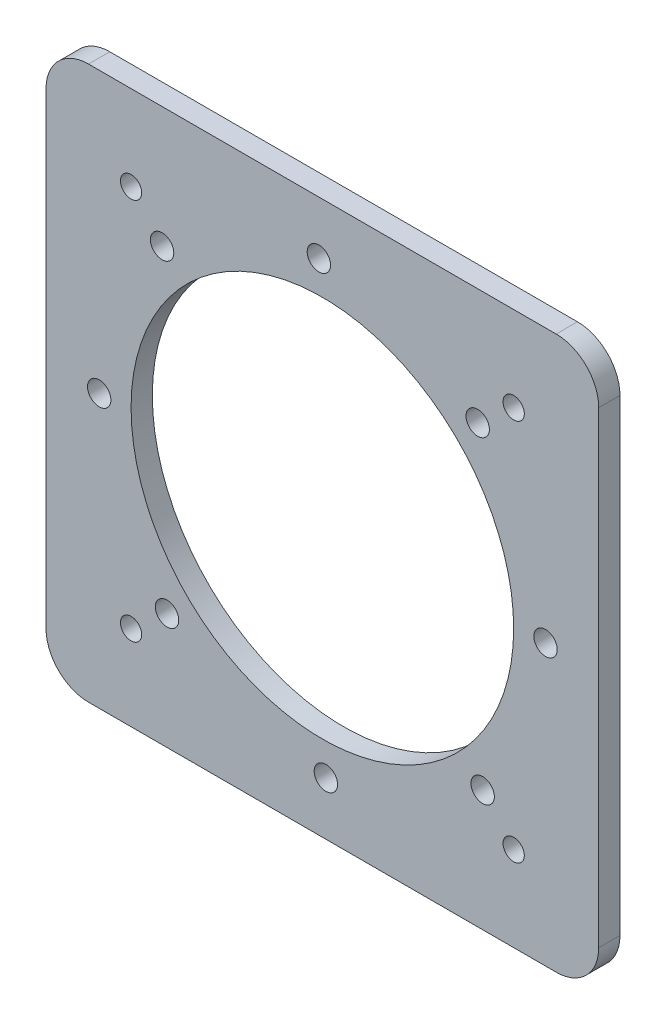
ISO-10303-21;
HEADER;
FILE_DESCRIPTION(('STEP AP214'),'2;1');
FILE_NAME('part.step','',(''),(''),'','','');
FILE_SCHEMA(('AUTOMOTIVE_DESIGN { 1 0 10303 214 1 1 1 1 }'));
ENDSEC;
DATA;
#1=APPLICATION_CONTEXT('core data for automotive mechanical design processes');
#2=APPLICATION_PROTOCOL_DEFINITION('international standard','automotive_design',2000,#1);
#3=PRODUCT_CONTEXT('',#1,'mechanical');
#4=PRODUCT('Part','Part','',(#3));
#5=PRODUCT_RELATED_PRODUCT_CATEGORY('part','',(#4));
#6=PRODUCT_DEFINITION_FORMATION('','',#4);
#7=PRODUCT_DEFINITION_CONTEXT('part definition',#1,'design');
#8=PRODUCT_DEFINITION('design','',#6,#7);
#9=PRODUCT_DEFINITION_SHAPE('','',#8);
#10=(LENGTH_UNIT() NAMED_UNIT(*) SI_UNIT(.MILLI.,.METRE.));
#11=(NAMED_UNIT(*) PLANE_ANGLE_UNIT() SI_UNIT($,.RADIAN.));
#12=(NAMED_UNIT(*) SI_UNIT($,.STERADIAN.) SOLID_ANGLE_UNIT());
#13=UNCERTAINTY_MEASURE_WITH_UNIT(LENGTH_MEASURE(1.E-05),#10,'distance_accuracy_value','');
#14=(GEOMETRIC_REPRESENTATION_CONTEXT(3) GLOBAL_UNCERTAINTY_ASSIGNED_CONTEXT((#13)) GLOBAL_UNIT_ASSIGNED_CONTEXT((#10,
#11,#12)) REPRESENTATION_CONTEXT('',''));
#15=CARTESIAN_POINT('',(0.,0.,0.));
#16=DIRECTION('',(0.,0.,1.));
#17=DIRECTION('',(1.,0.,0.));
#18=AXIS2_PLACEMENT_3D('',#15,#16,#17);
#19=CARTESIAN_POINT('',(65.,65.,5.));
#20=DIRECTION('',(-1.,0.,0.));
#21=DIRECTION('',(0.,-1.,0.));
#22=AXIS2_PLACEMENT_3D('',#19,#20,#21);
#23=PLANE('',#22);
#24=DIRECTION('',(0.,1.,0.));
#25=VECTOR('',#24,1.);
#26=CARTESIAN_POINT('',(65.,65.,0.));
#27=LINE('',#26,#25);
#28=CARTESIAN_POINT('',(65.,-55.,0.));
#29=VERTEX_POINT('',#28);
#30=CARTESIAN_POINT('',(65.,55.,0.));
#31=VERTEX_POINT('',#30);
#32=EDGE_CURVE('E138',#29,#31,#27,.T.);
#33=ORIENTED_EDGE('',*,*,#32,.T.);
#34=DIRECTION('',(0.,0.,-1.));
#35=VECTOR('',#34,1.);
#36=CARTESIAN_POINT('',(65.,55.,5.));
#37=LINE('',#36,#35);
#38=CARTESIAN_POINT('',(65.,55.,5.));
#39=VERTEX_POINT('',#38);
#40=EDGE_CURVE('E116',#31,#39,#37,.F.);
#41=ORIENTED_EDGE('',*,*,#40,.T.);
#42=DIRECTION('',(0.,1.,0.));
#43=VECTOR('',#42,1.);
#44=CARTESIAN_POINT('',(65.,65.,5.));
#45=LINE('',#44,#43);
#46=CARTESIAN_POINT('',(65.,-55.,5.));
#47=VERTEX_POINT('',#46);
#48=EDGE_CURVE('E148',#47,#39,#45,.T.);
#49=ORIENTED_EDGE('',*,*,#48,.F.);
#50=DIRECTION('',(0.,0.,-1.));
#51=VECTOR('',#50,1.);
#52=CARTESIAN_POINT('',(65.,-55.,5.));
#53=LINE('',#52,#51);
#54=EDGE_CURVE('E121',#47,#29,#53,.T.);
#55=ORIENTED_EDGE('',*,*,#54,.T.);
#56=EDGE_LOOP('',(#33,#41,#49,#55));
#57=FACE_BOUND('',#56,.T.);
#58=ADVANCED_FACE('F45',(#57),#23,.F.);
#59=CARTESIAN_POINT('',(-65.,65.,5.));
#60=DIRECTION('',(0.,-1.,0.));
#61=DIRECTION('',(0.,0.,-1.));
#62=AXIS2_PLACEMENT_3D('',#59,#60,#61);
#63=PLANE('',#62);
#64=DIRECTION('',(-1.,0.,0.));
#65=VECTOR('',#64,1.);
#66=CARTESIAN_POINT('',(-65.,65.,5.));
#67=LINE('',#66,#65);
#68=CARTESIAN_POINT('',(55.,65.,5.));
#69=VERTEX_POINT('',#68);
#70=CARTESIAN_POINT('',(-55.,65.,5.));
#71=VERTEX_POINT('',#70);
#72=EDGE_CURVE('E131',#69,#71,#67,.T.);
#73=ORIENTED_EDGE('',*,*,#72,.F.);
#74=DIRECTION('',(0.,0.,-1.));
#75=VECTOR('',#74,1.);
#76=CARTESIAN_POINT('',(55.,65.,5.));
#77=LINE('',#76,#75);
#78=CARTESIAN_POINT('',(55.,65.,0.));
#79=VERTEX_POINT('',#78);
#80=EDGE_CURVE('E115',#69,#79,#77,.T.);
#81=ORIENTED_EDGE('',*,*,#80,.T.);
#82=DIRECTION('',(-1.,0.,0.));
#83=VECTOR('',#82,1.);
#84=CARTESIAN_POINT('',(-65.,65.,0.));
#85=LINE('',#84,#83);
#86=CARTESIAN_POINT('',(-55.,65.,0.));
#87=VERTEX_POINT('',#86);
#88=EDGE_CURVE('E128',#79,#87,#85,.T.);
#89=ORIENTED_EDGE('',*,*,#88,.T.);
#90=DIRECTION('',(0.,0.,-1.));
#91=VECTOR('',#90,1.);
#92=CARTESIAN_POINT('',(-55.,65.,5.));
#93=LINE('',#92,#91);
#94=EDGE_CURVE('E133',#87,#71,#93,.F.);
#95=ORIENTED_EDGE('',*,*,#94,.T.);
#96=EDGE_LOOP('',(#73,#81,#89,#95));
#97=FACE_BOUND('',#96,.T.);
#98=ADVANCED_FACE('F127',(#97),#63,.F.);
#99=CARTESIAN_POINT('',(-65.,65.,5.));
#100=DIRECTION('',(1.,0.,0.));
#101=DIRECTION('',(0.,0.,-1.));
#102=AXIS2_PLACEMENT_3D('',#99,#100,#101);
#103=PLANE('',#102);
#104=DIRECTION('',(0.,-1.,0.));
#105=VECTOR('',#104,1.);
#106=CARTESIAN_POINT('',(-65.,65.,0.));
#107=LINE('',#106,#105);
#108=CARTESIAN_POINT('',(-65.,55.,0.));
#109=VERTEX_POINT('',#108);
#110=CARTESIAN_POINT('',(-65.,-55.,0.));
#111=VERTEX_POINT('',#110);
#112=EDGE_CURVE('E137',#109,#111,#107,.T.);
#113=ORIENTED_EDGE('',*,*,#112,.T.);
#114=DIRECTION('',(0.,0.,-1.));
#115=VECTOR('',#114,1.);
#116=CARTESIAN_POINT('',(-65.,-55.,5.));
#117=LINE('',#116,#115);
#118=CARTESIAN_POINT('',(-65.,-55.,5.));
#119=VERTEX_POINT('',#118);
#120=EDGE_CURVE('E11',#111,#119,#117,.F.);
#121=ORIENTED_EDGE('',*,*,#120,.T.);
#122=DIRECTION('',(0.,-1.,0.));
#123=VECTOR('',#122,1.);
#124=CARTESIAN_POINT('',(-65.,65.,5.));
#125=LINE('',#124,#123);
#126=CARTESIAN_POINT('',(-65.,55.,5.));
#127=VERTEX_POINT('',#126);
#128=EDGE_CURVE('E174',#127,#119,#125,.T.);
#129=ORIENTED_EDGE('',*,*,#128,.F.);
#130=DIRECTION('',(0.,0.,-1.));
#131=VECTOR('',#130,1.);
#132=CARTESIAN_POINT('',(-65.,55.,5.));
#133=LINE('',#132,#131);
#134=EDGE_CURVE('E53',#127,#109,#133,.T.);
#135=ORIENTED_EDGE('',*,*,#134,.T.);
#136=EDGE_LOOP('',(#113,#121,#129,#135));
#137=FACE_BOUND('',#136,.T.);
#138=ADVANCED_FACE('F172',(#137),#103,.F.);
#139=CARTESIAN_POINT('',(-65.,-65.,5.));
#140=DIRECTION('',(0.,1.,0.));
#141=DIRECTION('',(0.,0.,1.));
#142=AXIS2_PLACEMENT_3D('',#139,#140,#141);
#143=PLANE('',#142);
#144=DIRECTION('',(1.,0.,0.));
#145=VECTOR('',#144,1.);
#146=CARTESIAN_POINT('',(-65.,-65.,0.));
#147=LINE('',#146,#145);
#148=CARTESIAN_POINT('',(-55.,-65.,0.));
#149=VERTEX_POINT('',#148);
#150=CARTESIAN_POINT('',(55.,-65.,0.));
#151=VERTEX_POINT('',#150);
#152=EDGE_CURVE('E141',#149,#151,#147,.T.);
#153=ORIENTED_EDGE('',*,*,#152,.T.);
#154=DIRECTION('',(0.,0.,-1.));
#155=VECTOR('',#154,1.);
#156=CARTESIAN_POINT('',(55.,-65.,5.));
#157=LINE('',#156,#155);
#158=CARTESIAN_POINT('',(55.,-65.,5.));
#159=VERTEX_POINT('',#158);
#160=EDGE_CURVE('E60',#151,#159,#157,.F.);
#161=ORIENTED_EDGE('',*,*,#160,.T.);
#162=DIRECTION('',(1.,0.,0.));
#163=VECTOR('',#162,1.);
#164=CARTESIAN_POINT('',(-65.,-65.,5.));
#165=LINE('',#164,#163);
#166=CARTESIAN_POINT('',(-55.,-65.,5.));
#167=VERTEX_POINT('',#166);
#168=EDGE_CURVE('E149',#167,#159,#165,.T.);
#169=ORIENTED_EDGE('',*,*,#168,.F.);
#170=DIRECTION('',(0.,0.,-1.));
#171=VECTOR('',#170,1.);
#172=CARTESIAN_POINT('',(-55.,-65.,5.));
#173=LINE('',#172,#171);
#174=EDGE_CURVE('E165',#167,#149,#173,.T.);
#175=ORIENTED_EDGE('',*,*,#174,.T.);
#176=EDGE_LOOP('',(#153,#161,#169,#175));
#177=FACE_BOUND('',#176,.T.);
#178=ADVANCED_FACE('F181',(#177),#143,.F.);
#179=CARTESIAN_POINT('',(0.,0.,5.));
#180=DIRECTION('',(0.,0.,1.));
#181=DIRECTION('',(1.,0.,0.));
#182=AXIS2_PLACEMENT_3D('',#179,#180,#181);
#183=PLANE('',#182);
#184=CARTESIAN_POINT('',(-45.0000000002168,45.,5.));
#185=DIRECTION('',(0.,0.,1.));
#186=DIRECTION('',(1.,0.,0.));
#187=AXIS2_PLACEMENT_3D('',#184,#185,#186);
#188=CIRCLE('',#187,2.5);
#189=CARTESIAN_POINT('',(-42.5000000002168,45.,5.));
#190=VERTEX_POINT('',#189);
#191=EDGE_CURVE('E245',#190,#190,#188,.T.);
#192=ORIENTED_EDGE('',*,*,#191,.F.);
#193=EDGE_LOOP('',(#192));
#194=FACE_BOUND('',#193,.T.);
#195=CARTESIAN_POINT('',(44.9999999997842,-45.,5.));
#196=DIRECTION('',(0.,0.,1.));
#197=DIRECTION('',(1.,0.,0.));
#198=AXIS2_PLACEMENT_3D('',#195,#196,#197);
#199=CIRCLE('',#198,2.5);
#200=CARTESIAN_POINT('',(47.4999999997842,-45.,5.));
#201=VERTEX_POINT('',#200);
#202=EDGE_CURVE('E251',#201,#201,#199,.T.);
#203=ORIENTED_EDGE('',*,*,#202,.F.);
#204=EDGE_LOOP('',(#203));
#205=FACE_BOUND('',#204,.T.);
#206=CARTESIAN_POINT('',(-45.0000000002158,-45.,5.));
#207=DIRECTION('',(0.,0.,1.));
#208=DIRECTION('',(1.,0.,0.));
#209=AXIS2_PLACEMENT_3D('',#206,#207,#208);
#210=CIRCLE('',#209,2.5);
#211=CARTESIAN_POINT('',(-42.5000000002158,-45.,5.));
#212=VERTEX_POINT('',#211);
#213=EDGE_CURVE('E252',#212,#212,#210,.T.);
#214=ORIENTED_EDGE('',*,*,#213,.F.);
#215=EDGE_LOOP('',(#214));
#216=FACE_BOUND('',#215,.T.);
#217=CARTESIAN_POINT('',(44.9999999997832,45.,5.));
#218=DIRECTION('',(0.,0.,1.));
#219=DIRECTION('',(1.,0.,0.));
#220=AXIS2_PLACEMENT_3D('',#217,#218,#219);
#221=CIRCLE('',#220,2.5);
#222=CARTESIAN_POINT('',(47.4999999997832,45.,5.));
#223=VERTEX_POINT('',#222);
#224=EDGE_CURVE('E242',#223,#223,#221,.T.);
#225=ORIENTED_EDGE('',*,*,#224,.F.);
#226=EDGE_LOOP('',(#225));
#227=FACE_BOUND('',#226,.T.);
#228=CARTESIAN_POINT('',(-52.493537780627,-0.823705817561204,5.));
#229=DIRECTION('',(0.,0.,1.));
#230=DIRECTION('',(1.,0.,0.));
#231=AXIS2_PLACEMENT_3D('',#228,#229,#230);
#232=CIRCLE('',#231,2.75);
#233=CARTESIAN_POINT('',(-49.743537780627,-0.823705817561204,5.));
#234=VERTEX_POINT('',#233);
#235=EDGE_CURVE('E191',#234,#234,#232,.T.);
#236=ORIENTED_EDGE('',*,*,#235,.F.);
#237=EDGE_LOOP('',(#236));
#238=FACE_BOUND('',#237,.T.);
#239=CARTESIAN_POINT('',(-36.5360885638533,-37.7009845024539,5.));
#240=DIRECTION('',(0.,0.,1.));
#241=DIRECTION('',(1.,0.,0.));
#242=AXIS2_PLACEMENT_3D('',#239,#240,#241);
#243=CIRCLE('',#242,2.75);
#244=CARTESIAN_POINT('',(-33.7860885638533,-37.7009845024539,5.));
#245=VERTEX_POINT('',#244);
#246=EDGE_CURVE('E196',#245,#245,#243,.T.);
#247=ORIENTED_EDGE('',*,*,#246,.F.);
#248=EDGE_LOOP('',(#247));
#249=FACE_BOUND('',#248,.T.);
#250=CARTESIAN_POINT('',(0.823705817561204,-52.493537780627,5.));
#251=DIRECTION('',(0.,0.,1.));
#252=DIRECTION('',(1.,0.,0.));
#253=AXIS2_PLACEMENT_3D('',#250,#251,#252);
#254=CIRCLE('',#253,2.75);
#255=CARTESIAN_POINT('',(3.5737058175612,-52.493537780627,5.));
#256=VERTEX_POINT('',#255);
#257=EDGE_CURVE('E199',#256,#256,#254,.T.);
#258=ORIENTED_EDGE('',*,*,#257,.F.);
#259=EDGE_LOOP('',(#258));
#260=FACE_BOUND('',#259,.T.);
#261=CARTESIAN_POINT('',(37.7009845024539,-36.5360885638533,5.));
#262=DIRECTION('',(0.,0.,1.));
#263=DIRECTION('',(1.,0.,0.));
#264=AXIS2_PLACEMENT_3D('',#261,#262,#263);
#265=CIRCLE('',#264,2.75);
#266=CARTESIAN_POINT('',(40.4509845024539,-36.5360885638533,5.));
#267=VERTEX_POINT('',#266);
#268=EDGE_CURVE('E202',#267,#267,#265,.T.);
#269=ORIENTED_EDGE('',*,*,#268,.F.);
#270=EDGE_LOOP('',(#269));
#271=FACE_BOUND('',#270,.T.);
#272=CARTESIAN_POINT('',(52.493537780627,0.823705817561204,5.));
#273=DIRECTION('',(0.,0.,1.));
#274=DIRECTION('',(1.,0.,0.));
#275=AXIS2_PLACEMENT_3D('',#272,#273,#274);
#276=CIRCLE('',#275,2.75);
#277=CARTESIAN_POINT('',(55.243537780627,0.823705817561204,5.));
#278=VERTEX_POINT('',#277);
#279=EDGE_CURVE('E205',#278,#278,#276,.T.);
#280=ORIENTED_EDGE('',*,*,#279,.F.);
#281=EDGE_LOOP('',(#280));
#282=FACE_BOUND('',#281,.T.);
#283=CARTESIAN_POINT('',(36.5360885638533,37.7009845024539,5.));
#284=DIRECTION('',(0.,0.,1.));
#285=DIRECTION('',(1.,0.,0.));
#286=AXIS2_PLACEMENT_3D('',#283,#284,#285);
#287=CIRCLE('',#286,2.75);
#288=CARTESIAN_POINT('',(39.2860885638533,37.7009845024539,5.));
#289=VERTEX_POINT('',#288);
#290=EDGE_CURVE('E208',#289,#289,#287,.T.);
#291=ORIENTED_EDGE('',*,*,#290,.F.);
#292=EDGE_LOOP('',(#291));
#293=FACE_BOUND('',#292,.T.);
#294=CARTESIAN_POINT('',(-0.823705817561134,52.493537780627,5.));
#295=DIRECTION('',(0.,0.,1.));
#296=DIRECTION('',(1.,0.,0.));
#297=AXIS2_PLACEMENT_3D('',#294,#295,#296);
#298=CIRCLE('',#297,2.75);
#299=CARTESIAN_POINT('',(1.92629418243886,52.493537780627,5.));
#300=VERTEX_POINT('',#299);
#301=EDGE_CURVE('E211',#300,#300,#298,.T.);
#302=ORIENTED_EDGE('',*,*,#301,.F.);
#303=EDGE_LOOP('',(#302));
#304=FACE_BOUND('',#303,.T.);
#305=CARTESIAN_POINT('',(-37.7009845024539,36.5360885638533,5.));
#306=DIRECTION('',(0.,0.,1.));
#307=DIRECTION('',(1.,0.,0.));
#308=AXIS2_PLACEMENT_3D('',#305,#306,#307);
#309=CIRCLE('',#308,2.75);
#310=CARTESIAN_POINT('',(-34.9509845024539,36.5360885638533,5.));
#311=VERTEX_POINT('',#310);
#312=EDGE_CURVE('E214',#311,#311,#309,.T.);
#313=ORIENTED_EDGE('',*,*,#312,.F.);
#314=EDGE_LOOP('',(#313));
#315=FACE_BOUND('',#314,.T.);
#316=CARTESIAN_POINT('',(0.,0.,5.));
#317=DIRECTION('',(0.,0.,1.));
#318=DIRECTION('',(1.,0.,0.));
#319=AXIS2_PLACEMENT_3D('',#316,#317,#318);
#320=CIRCLE('',#319,45.);
#321=CARTESIAN_POINT('',(45.,0.,5.));
#322=VERTEX_POINT('',#321);
#323=EDGE_CURVE('E188',#322,#322,#320,.F.);
#324=ORIENTED_EDGE('',*,*,#323,.T.);
#325=EDGE_LOOP('',(#324));
#326=FACE_BOUND('',#325,.T.);
#327=ORIENTED_EDGE('',*,*,#48,.T.);
#328=CARTESIAN_POINT('',(55.,55.,5.));
#329=DIRECTION('',(0.,0.,1.));
#330=DIRECTION('',(1.,0.,0.));
#331=AXIS2_PLACEMENT_3D('',#328,#329,#330);
#332=CIRCLE('',#331,10.);
#333=EDGE_CURVE('E163',#39,#69,#332,.T.);
#334=ORIENTED_EDGE('',*,*,#333,.T.);
#335=ORIENTED_EDGE('',*,*,#72,.T.);
#336=CARTESIAN_POINT('',(-55.,55.,5.));
#337=DIRECTION('',(0.,0.,1.));
#338=DIRECTION('',(1.,0.,0.));
#339=AXIS2_PLACEMENT_3D('',#336,#337,#338);
#340=CIRCLE('',#339,10.);
#341=EDGE_CURVE('E158',#71,#127,#340,.T.);
#342=ORIENTED_EDGE('',*,*,#341,.T.);
#343=ORIENTED_EDGE('',*,*,#128,.T.);
#344=CARTESIAN_POINT('',(-55.,-55.,5.));
#345=DIRECTION('',(0.,0.,1.));
#346=DIRECTION('',(1.,0.,0.));
#347=AXIS2_PLACEMENT_3D('',#344,#345,#346);
#348=CIRCLE('',#347,10.);
#349=EDGE_CURVE('E67',#119,#167,#348,.T.);
#350=ORIENTED_EDGE('',*,*,#349,.T.);
#351=ORIENTED_EDGE('',*,*,#168,.T.);
#352=CARTESIAN_POINT('',(55.,-55.,5.));
#353=DIRECTION('',(0.,0.,1.));
#354=DIRECTION('',(1.,0.,0.));
#355=AXIS2_PLACEMENT_3D('',#352,#353,#354);
#356=CIRCLE('',#355,10.);
#357=EDGE_CURVE('E161',#159,#47,#356,.T.);
#358=ORIENTED_EDGE('',*,*,#357,.T.);
#359=EDGE_LOOP('',(#327,#334,#335,#342,#343,#350,#351,#358));
#360=FACE_BOUND('',#359,.T.);
#361=ADVANCED_FACE('F268',(#194,#205,#216,#227,#238,#249,#260,#271,#282,#293,#304,#315,#326,
#360),#183,.T.);
#362=CARTESIAN_POINT('',(0.,0.,0.));
#363=DIRECTION('',(0.,0.,1.));
#364=DIRECTION('',(1.,0.,0.));
#365=AXIS2_PLACEMENT_3D('',#362,#363,#364);
#366=PLANE('',#365);
#367=CARTESIAN_POINT('',(-45.0000000002168,45.,0.));
#368=DIRECTION('',(0.,0.,1.));
#369=DIRECTION('',(1.,0.,0.));
#370=AXIS2_PLACEMENT_3D('',#367,#368,#369);
#371=CIRCLE('',#370,2.5);
#372=CARTESIAN_POINT('',(-42.5000000002168,45.,0.));
#373=VERTEX_POINT('',#372);
#374=EDGE_CURVE('E255',#373,#373,#371,.T.);
#375=ORIENTED_EDGE('',*,*,#374,.T.);
#376=EDGE_LOOP('',(#375));
#377=FACE_BOUND('',#376,.T.);
#378=CARTESIAN_POINT('',(44.9999999997842,-45.,0.));
#379=DIRECTION('',(0.,0.,1.));
#380=DIRECTION('',(1.,0.,0.));
#381=AXIS2_PLACEMENT_3D('',#378,#379,#380);
#382=CIRCLE('',#381,2.5);
#383=CARTESIAN_POINT('',(47.4999999997842,-45.,0.));
#384=VERTEX_POINT('',#383);
#385=EDGE_CURVE('E248',#384,#384,#382,.T.);
#386=ORIENTED_EDGE('',*,*,#385,.T.);
#387=EDGE_LOOP('',(#386));
#388=FACE_BOUND('',#387,.T.);
#389=CARTESIAN_POINT('',(-45.0000000002158,-45.,0.));
#390=DIRECTION('',(0.,0.,1.));
#391=DIRECTION('',(1.,0.,0.));
#392=AXIS2_PLACEMENT_3D('',#389,#390,#391);
#393=CIRCLE('',#392,2.5);
#394=CARTESIAN_POINT('',(-42.5000000002158,-45.,0.));
#395=VERTEX_POINT('',#394);
#396=EDGE_CURVE('E260',#395,#395,#393,.T.);
#397=ORIENTED_EDGE('',*,*,#396,.T.);
#398=EDGE_LOOP('',(#397));
#399=FACE_BOUND('',#398,.T.);
#400=CARTESIAN_POINT('',(44.9999999997832,45.,0.));
#401=DIRECTION('',(0.,0.,1.));
#402=DIRECTION('',(1.,0.,0.));
#403=AXIS2_PLACEMENT_3D('',#400,#401,#402);
#404=CIRCLE('',#403,2.5);
#405=CARTESIAN_POINT('',(47.4999999997832,45.,0.));
#406=VERTEX_POINT('',#405);
#407=EDGE_CURVE('E237',#406,#406,#404,.T.);
#408=ORIENTED_EDGE('',*,*,#407,.T.);
#409=EDGE_LOOP('',(#408));
#410=FACE_BOUND('',#409,.T.);
#411=CARTESIAN_POINT('',(-52.493537780627,-0.823705817561204,0.));
#412=DIRECTION('',(0.,0.,-1.));
#413=DIRECTION('',(-1.,0.,0.));
#414=AXIS2_PLACEMENT_3D('',#411,#412,#413);
#415=CIRCLE('',#414,2.75);
#416=CARTESIAN_POINT('',(-55.243537780627,-0.823705817561204,0.));
#417=VERTEX_POINT('',#416);
#418=EDGE_CURVE('E220',#417,#417,#415,.T.);
#419=ORIENTED_EDGE('',*,*,#418,.F.);
#420=EDGE_LOOP('',(#419));
#421=FACE_BOUND('',#420,.T.);
#422=CARTESIAN_POINT('',(-36.5360885638533,-37.7009845024539,0.));
#423=DIRECTION('',(0.,0.,-1.));
#424=DIRECTION('',(-1.,0.,0.));
#425=AXIS2_PLACEMENT_3D('',#422,#423,#424);
#426=CIRCLE('',#425,2.75);
#427=CARTESIAN_POINT('',(-39.2860885638533,-37.7009845024539,0.));
#428=VERTEX_POINT('',#427);
#429=EDGE_CURVE('E228',#428,#428,#426,.T.);
#430=ORIENTED_EDGE('',*,*,#429,.F.);
#431=EDGE_LOOP('',(#430));
#432=FACE_BOUND('',#431,.T.);
#433=CARTESIAN_POINT('',(0.823705817561204,-52.493537780627,0.));
#434=DIRECTION('',(0.,0.,-1.));
#435=DIRECTION('',(-1.,0.,0.));
#436=AXIS2_PLACEMENT_3D('',#433,#434,#435);
#437=CIRCLE('',#436,2.75);
#438=CARTESIAN_POINT('',(-1.9262941824388,-52.493537780627,0.));
#439=VERTEX_POINT('',#438);
#440=EDGE_CURVE('E224',#439,#439,#437,.T.);
#441=ORIENTED_EDGE('',*,*,#440,.F.);
#442=EDGE_LOOP('',(#441));
#443=FACE_BOUND('',#442,.T.);
#444=CARTESIAN_POINT('',(37.7009845024539,-36.5360885638533,0.));
#445=DIRECTION('',(0.,0.,-1.));
#446=DIRECTION('',(-1.,0.,0.));
#447=AXIS2_PLACEMENT_3D('',#444,#445,#446);
#448=CIRCLE('',#447,2.75);
#449=CARTESIAN_POINT('',(34.9509845024539,-36.5360885638533,0.));
#450=VERTEX_POINT('',#449);
#451=EDGE_CURVE('E221',#450,#450,#448,.T.);
#452=ORIENTED_EDGE('',*,*,#451,.F.);
#453=EDGE_LOOP('',(#452));
#454=FACE_BOUND('',#453,.T.);
#455=CARTESIAN_POINT('',(52.493537780627,0.823705817561204,0.));
#456=DIRECTION('',(0.,0.,-1.));
#457=DIRECTION('',(-1.,0.,0.));
#458=AXIS2_PLACEMENT_3D('',#455,#456,#457);
#459=CIRCLE('',#458,2.75);
#460=CARTESIAN_POINT('',(49.743537780627,0.823705817561204,0.));
#461=VERTEX_POINT('',#460);
#462=EDGE_CURVE('E225',#461,#461,#459,.T.);
#463=ORIENTED_EDGE('',*,*,#462,.F.);
#464=EDGE_LOOP('',(#463));
#465=FACE_BOUND('',#464,.T.);
#466=CARTESIAN_POINT('',(36.5360885638533,37.7009845024539,0.));
#467=DIRECTION('',(0.,0.,-1.));
#468=DIRECTION('',(-1.,0.,0.));
#469=AXIS2_PLACEMENT_3D('',#466,#467,#468);
#470=CIRCLE('',#469,2.75);
#471=CARTESIAN_POINT('',(33.7860885638533,37.7009845024539,0.));
#472=VERTEX_POINT('',#471);
#473=EDGE_CURVE('E236',#472,#472,#470,.T.);
#474=ORIENTED_EDGE('',*,*,#473,.F.);
#475=EDGE_LOOP('',(#474));
#476=FACE_BOUND('',#475,.T.);
#477=CARTESIAN_POINT('',(-0.823705817561134,52.493537780627,0.));
#478=DIRECTION('',(0.,0.,-1.));
#479=DIRECTION('',(-1.,0.,0.));
#480=AXIS2_PLACEMENT_3D('',#477,#478,#479);
#481=CIRCLE('',#480,2.75);
#482=CARTESIAN_POINT('',(-3.57370581756113,52.493537780627,0.));
#483=VERTEX_POINT('',#482);
#484=EDGE_CURVE('E233',#483,#483,#481,.T.);
#485=ORIENTED_EDGE('',*,*,#484,.F.);
#486=EDGE_LOOP('',(#485));
#487=FACE_BOUND('',#486,.T.);
#488=CARTESIAN_POINT('',(-37.7009845024539,36.5360885638533,0.));
#489=DIRECTION('',(0.,0.,-1.));
#490=DIRECTION('',(-1.,0.,0.));
#491=AXIS2_PLACEMENT_3D('',#488,#489,#490);
#492=CIRCLE('',#491,2.75);
#493=CARTESIAN_POINT('',(-40.4509845024539,36.5360885638533,0.));
#494=VERTEX_POINT('',#493);
#495=EDGE_CURVE('E217',#494,#494,#492,.T.);
#496=ORIENTED_EDGE('',*,*,#495,.F.);
#497=EDGE_LOOP('',(#496));
#498=FACE_BOUND('',#497,.T.);
#499=CARTESIAN_POINT('',(0.,0.,0.));
#500=DIRECTION('',(0.,0.,-1.));
#501=DIRECTION('',(-1.,0.,0.));
#502=AXIS2_PLACEMENT_3D('',#499,#500,#501);
#503=CIRCLE('',#502,45.);
#504=CARTESIAN_POINT('',(-45.,0.,0.));
#505=VERTEX_POINT('',#504);
#506=EDGE_CURVE('E143',#505,#505,#503,.T.);
#507=ORIENTED_EDGE('',*,*,#506,.F.);
#508=EDGE_LOOP('',(#507));
#509=FACE_BOUND('',#508,.T.);
#510=ORIENTED_EDGE('',*,*,#88,.F.);
#511=CARTESIAN_POINT('',(55.,55.,0.));
#512=DIRECTION('',(0.,0.,1.));
#513=DIRECTION('',(1.,0.,0.));
#514=AXIS2_PLACEMENT_3D('',#511,#512,#513);
#515=CIRCLE('',#514,10.);
#516=EDGE_CURVE('E111',#79,#31,#515,.F.);
#517=ORIENTED_EDGE('',*,*,#516,.T.);
#518=ORIENTED_EDGE('',*,*,#32,.F.);
#519=CARTESIAN_POINT('',(55.,-55.,0.));
#520=DIRECTION('',(0.,0.,1.));
#521=DIRECTION('',(1.,0.,0.));
#522=AXIS2_PLACEMENT_3D('',#519,#520,#521);
#523=CIRCLE('',#522,10.);
#524=EDGE_CURVE('E122',#29,#151,#523,.F.);
#525=ORIENTED_EDGE('',*,*,#524,.T.);
#526=ORIENTED_EDGE('',*,*,#152,.F.);
#527=CARTESIAN_POINT('',(-55.,-55.,0.));
#528=DIRECTION('',(0.,0.,1.));
#529=DIRECTION('',(1.,0.,0.));
#530=AXIS2_PLACEMENT_3D('',#527,#528,#529);
#531=CIRCLE('',#530,10.);
#532=EDGE_CURVE('E152',#149,#111,#531,.F.);
#533=ORIENTED_EDGE('',*,*,#532,.T.);
#534=ORIENTED_EDGE('',*,*,#112,.F.);
#535=CARTESIAN_POINT('',(-55.,55.,0.));
#536=DIRECTION('',(0.,0.,1.));
#537=DIRECTION('',(1.,0.,0.));
#538=AXIS2_PLACEMENT_3D('',#535,#536,#537);
#539=CIRCLE('',#538,10.);
#540=EDGE_CURVE('E132',#109,#87,#539,.F.);
#541=ORIENTED_EDGE('',*,*,#540,.T.);
#542=EDGE_LOOP('',(#510,#517,#518,#525,#526,#533,#534,#541));
#543=FACE_BOUND('',#542,.T.);
#544=ADVANCED_FACE('F135',(#377,#388,#399,#410,#421,#432,#443,#454,#465,#476,#487,#498,#509,
#543),#366,.F.);
#545=CARTESIAN_POINT('',(0.,0.,5.001));
#546=DIRECTION('',(0.,0.,-1.));
#547=DIRECTION('',(-1.,0.,0.));
#548=AXIS2_PLACEMENT_3D('',#545,#546,#547);
#549=CYLINDRICAL_SURFACE('',#548,45.);
#550=ORIENTED_EDGE('',*,*,#323,.F.);
#551=EDGE_LOOP('',(#550));
#552=FACE_BOUND('',#551,.T.);
#553=ORIENTED_EDGE('',*,*,#506,.T.);
#554=EDGE_LOOP('',(#553));
#555=FACE_BOUND('',#554,.T.);
#556=ADVANCED_FACE('F303',(#552,#555),#549,.F.);
#557=CARTESIAN_POINT('',(55.,55.,5.));
#558=DIRECTION('',(0.,0.,-1.));
#559=DIRECTION('',(-1.,0.,0.));
#560=AXIS2_PLACEMENT_3D('',#557,#558,#559);
#561=CYLINDRICAL_SURFACE('',#560,10.);
#562=ORIENTED_EDGE('',*,*,#333,.F.);
#563=ORIENTED_EDGE('',*,*,#40,.F.);
#564=ORIENTED_EDGE('',*,*,#516,.F.);
#565=ORIENTED_EDGE('',*,*,#80,.F.);
#566=EDGE_LOOP('',(#562,#563,#564,#565));
#567=FACE_BOUND('',#566,.T.);
#568=ADVANCED_FACE('F114',(#567),#561,.T.);
#569=CARTESIAN_POINT('',(55.,-55.,5.));
#570=DIRECTION('',(0.,0.,-1.));
#571=DIRECTION('',(-1.,0.,0.));
#572=AXIS2_PLACEMENT_3D('',#569,#570,#571);
#573=CYLINDRICAL_SURFACE('',#572,10.);
#574=ORIENTED_EDGE('',*,*,#357,.F.);
#575=ORIENTED_EDGE('',*,*,#160,.F.);
#576=ORIENTED_EDGE('',*,*,#524,.F.);
#577=ORIENTED_EDGE('',*,*,#54,.F.);
#578=EDGE_LOOP('',(#574,#575,#576,#577));
#579=FACE_BOUND('',#578,.T.);
#580=ADVANCED_FACE('F296',(#579),#573,.T.);
#581=CARTESIAN_POINT('',(-55.,-55.,5.));
#582=DIRECTION('',(0.,0.,-1.));
#583=DIRECTION('',(-1.,0.,0.));
#584=AXIS2_PLACEMENT_3D('',#581,#582,#583);
#585=CYLINDRICAL_SURFACE('',#584,10.);
#586=ORIENTED_EDGE('',*,*,#349,.F.);
#587=ORIENTED_EDGE('',*,*,#120,.F.);
#588=ORIENTED_EDGE('',*,*,#532,.F.);
#589=ORIENTED_EDGE('',*,*,#174,.F.);
#590=EDGE_LOOP('',(#586,#587,#588,#589));
#591=FACE_BOUND('',#590,.T.);
#592=ADVANCED_FACE('F180',(#591),#585,.T.);
#593=CARTESIAN_POINT('',(-55.,55.,5.));
#594=DIRECTION('',(0.,0.,-1.));
#595=DIRECTION('',(-1.,0.,0.));
#596=AXIS2_PLACEMENT_3D('',#593,#594,#595);
#597=CYLINDRICAL_SURFACE('',#596,10.);
#598=ORIENTED_EDGE('',*,*,#341,.F.);
#599=ORIENTED_EDGE('',*,*,#94,.F.);
#600=ORIENTED_EDGE('',*,*,#540,.F.);
#601=ORIENTED_EDGE('',*,*,#134,.F.);
#602=EDGE_LOOP('',(#598,#599,#600,#601));
#603=FACE_BOUND('',#602,.T.);
#604=ADVANCED_FACE('F47',(#603),#597,.T.);
#605=CARTESIAN_POINT('',(-37.7009845024539,36.5360885638533,10.));
#606=DIRECTION('',(0.,0.,-1.));
#607=DIRECTION('',(-1.,0.,0.));
#608=AXIS2_PLACEMENT_3D('',#605,#606,#607);
#609=CYLINDRICAL_SURFACE('',#608,2.75);
#610=ORIENTED_EDGE('',*,*,#312,.T.);
#611=EDGE_LOOP('',(#610));
#612=FACE_BOUND('',#611,.T.);
#613=ORIENTED_EDGE('',*,*,#495,.T.);
#614=EDGE_LOOP('',(#613));
#615=FACE_BOUND('',#614,.T.);
#616=ADVANCED_FACE('F322',(#612,#615),#609,.F.);
#617=CARTESIAN_POINT('',(-0.823705817561134,52.493537780627,10.));
#618=DIRECTION('',(0.,0.,-1.));
#619=DIRECTION('',(-1.,0.,0.));
#620=AXIS2_PLACEMENT_3D('',#617,#618,#619);
#621=CYLINDRICAL_SURFACE('',#620,2.75);
#622=ORIENTED_EDGE('',*,*,#301,.T.);
#623=EDGE_LOOP('',(#622));
#624=FACE_BOUND('',#623,.T.);
#625=ORIENTED_EDGE('',*,*,#484,.T.);
#626=EDGE_LOOP('',(#625));
#627=FACE_BOUND('',#626,.T.);
#628=ADVANCED_FACE('F325',(#624,#627),#621,.F.);
#629=CARTESIAN_POINT('',(36.5360885638533,37.7009845024539,10.));
#630=DIRECTION('',(0.,0.,-1.));
#631=DIRECTION('',(-1.,0.,0.));
#632=AXIS2_PLACEMENT_3D('',#629,#630,#631);
#633=CYLINDRICAL_SURFACE('',#632,2.75);
#634=ORIENTED_EDGE('',*,*,#290,.T.);
#635=EDGE_LOOP('',(#634));
#636=FACE_BOUND('',#635,.T.);
#637=ORIENTED_EDGE('',*,*,#473,.T.);
#638=EDGE_LOOP('',(#637));
#639=FACE_BOUND('',#638,.T.);
#640=ADVANCED_FACE('F347',(#636,#639),#633,.F.);
#641=CARTESIAN_POINT('',(52.493537780627,0.823705817561204,10.));
#642=DIRECTION('',(0.,0.,-1.));
#643=DIRECTION('',(-1.,0.,0.));
#644=AXIS2_PLACEMENT_3D('',#641,#642,#643);
#645=CYLINDRICAL_SURFACE('',#644,2.75);
#646=ORIENTED_EDGE('',*,*,#279,.T.);
#647=EDGE_LOOP('',(#646));
#648=FACE_BOUND('',#647,.T.);
#649=ORIENTED_EDGE('',*,*,#462,.T.);
#650=EDGE_LOOP('',(#649));
#651=FACE_BOUND('',#650,.T.);
#652=ADVANCED_FACE('F331',(#648,#651),#645,.F.);
#653=CARTESIAN_POINT('',(37.7009845024539,-36.5360885638533,10.));
#654=DIRECTION('',(0.,0.,-1.));
#655=DIRECTION('',(-1.,0.,0.));
#656=AXIS2_PLACEMENT_3D('',#653,#654,#655);
#657=CYLINDRICAL_SURFACE('',#656,2.75);
#658=ORIENTED_EDGE('',*,*,#268,.T.);
#659=EDGE_LOOP('',(#658));
#660=FACE_BOUND('',#659,.T.);
#661=ORIENTED_EDGE('',*,*,#451,.T.);
#662=EDGE_LOOP('',(#661));
#663=FACE_BOUND('',#662,.T.);
#664=ADVANCED_FACE('F327',(#660,#663),#657,.F.);
#665=CARTESIAN_POINT('',(0.823705817561204,-52.493537780627,10.));
#666=DIRECTION('',(0.,0.,-1.));
#667=DIRECTION('',(-1.,0.,0.));
#668=AXIS2_PLACEMENT_3D('',#665,#666,#667);
#669=CYLINDRICAL_SURFACE('',#668,2.75);
#670=ORIENTED_EDGE('',*,*,#257,.T.);
#671=EDGE_LOOP('',(#670));
#672=FACE_BOUND('',#671,.T.);
#673=ORIENTED_EDGE('',*,*,#440,.T.);
#674=EDGE_LOOP('',(#673));
#675=FACE_BOUND('',#674,.T.);
#676=ADVANCED_FACE('F330',(#672,#675),#669,.F.);
#677=CARTESIAN_POINT('',(-36.5360885638533,-37.7009845024539,10.));
#678=DIRECTION('',(0.,0.,-1.));
#679=DIRECTION('',(-1.,0.,0.));
#680=AXIS2_PLACEMENT_3D('',#677,#678,#679);
#681=CYLINDRICAL_SURFACE('',#680,2.75);
#682=ORIENTED_EDGE('',*,*,#246,.T.);
#683=EDGE_LOOP('',(#682));
#684=FACE_BOUND('',#683,.T.);
#685=ORIENTED_EDGE('',*,*,#429,.T.);
#686=EDGE_LOOP('',(#685));
#687=FACE_BOUND('',#686,.T.);
#688=ADVANCED_FACE('F335',(#684,#687),#681,.F.);
#689=CARTESIAN_POINT('',(-52.493537780627,-0.823705817561204,10.));
#690=DIRECTION('',(0.,0.,-1.));
#691=DIRECTION('',(-1.,0.,0.));
#692=AXIS2_PLACEMENT_3D('',#689,#690,#691);
#693=CYLINDRICAL_SURFACE('',#692,2.75);
#694=ORIENTED_EDGE('',*,*,#235,.T.);
#695=EDGE_LOOP('',(#694));
#696=FACE_BOUND('',#695,.T.);
#697=ORIENTED_EDGE('',*,*,#418,.T.);
#698=EDGE_LOOP('',(#697));
#699=FACE_BOUND('',#698,.T.);
#700=ADVANCED_FACE('F339',(#696,#699),#693,.F.);
#701=CARTESIAN_POINT('',(44.9999999997832,45.,0.));
#702=DIRECTION('',(0.,0.,1.));
#703=DIRECTION('',(1.,0.,0.));
#704=AXIS2_PLACEMENT_3D('',#701,#702,#703);
#705=CYLINDRICAL_SURFACE('',#704,2.5);
#706=ORIENTED_EDGE('',*,*,#407,.F.);
#707=EDGE_LOOP('',(#706));
#708=FACE_BOUND('',#707,.T.);
#709=ORIENTED_EDGE('',*,*,#224,.T.);
#710=EDGE_LOOP('',(#709));
#711=FACE_BOUND('',#710,.T.);
#712=ADVANCED_FACE('F343',(#708,#711),#705,.F.);
#713=CARTESIAN_POINT('',(-45.0000000002158,-45.,0.));
#714=DIRECTION('',(0.,0.,1.));
#715=DIRECTION('',(1.,0.,0.));
#716=AXIS2_PLACEMENT_3D('',#713,#714,#715);
#717=CYLINDRICAL_SURFACE('',#716,2.5);
#718=ORIENTED_EDGE('',*,*,#396,.F.);
#719=EDGE_LOOP('',(#718));
#720=FACE_BOUND('',#719,.T.);
#721=ORIENTED_EDGE('',*,*,#213,.T.);
#722=EDGE_LOOP('',(#721));
#723=FACE_BOUND('',#722,.T.);
#724=ADVANCED_FACE('F266',(#720,#723),#717,.F.);
#725=CARTESIAN_POINT('',(44.9999999997842,-45.,0.));
#726=DIRECTION('',(0.,0.,1.));
#727=DIRECTION('',(1.,0.,0.));
#728=AXIS2_PLACEMENT_3D('',#725,#726,#727);
#729=CYLINDRICAL_SURFACE('',#728,2.5);
#730=ORIENTED_EDGE('',*,*,#385,.F.);
#731=EDGE_LOOP('',(#730));
#732=FACE_BOUND('',#731,.T.);
#733=ORIENTED_EDGE('',*,*,#202,.T.);
#734=EDGE_LOOP('',(#733));
#735=FACE_BOUND('',#734,.T.);
#736=ADVANCED_FACE('F358',(#732,#735),#729,.F.);
#737=CARTESIAN_POINT('',(-45.0000000002168,45.,0.));
#738=DIRECTION('',(0.,0.,1.));
#739=DIRECTION('',(1.,0.,0.));
#740=AXIS2_PLACEMENT_3D('',#737,#738,#739);
#741=CYLINDRICAL_SURFACE('',#740,2.5);
#742=ORIENTED_EDGE('',*,*,#374,.F.);
#743=EDGE_LOOP('',(#742));
#744=FACE_BOUND('',#743,.T.);
#745=ORIENTED_EDGE('',*,*,#191,.T.);
#746=EDGE_LOOP('',(#745));
#747=FACE_BOUND('',#746,.T.);
#748=ADVANCED_FACE('F361',(#744,#747),#741,.F.);
#749=CLOSED_SHELL('',(#58,#98,#138,#178,#361,#544,#556,#568,#580,#592,#604,#616,#628,#640,#652,
#664,#676,#688,#700,#712,#724,#736,#748));
#750=MANIFOLD_SOLID_BREP('B2',#749);
#751=ADVANCED_BREP_SHAPE_REPRESENTATION('',(#18,#750),#14);
#752=SHAPE_DEFINITION_REPRESENTATION(#9,#751);
ENDSEC;
END-ISO-10303-21;
